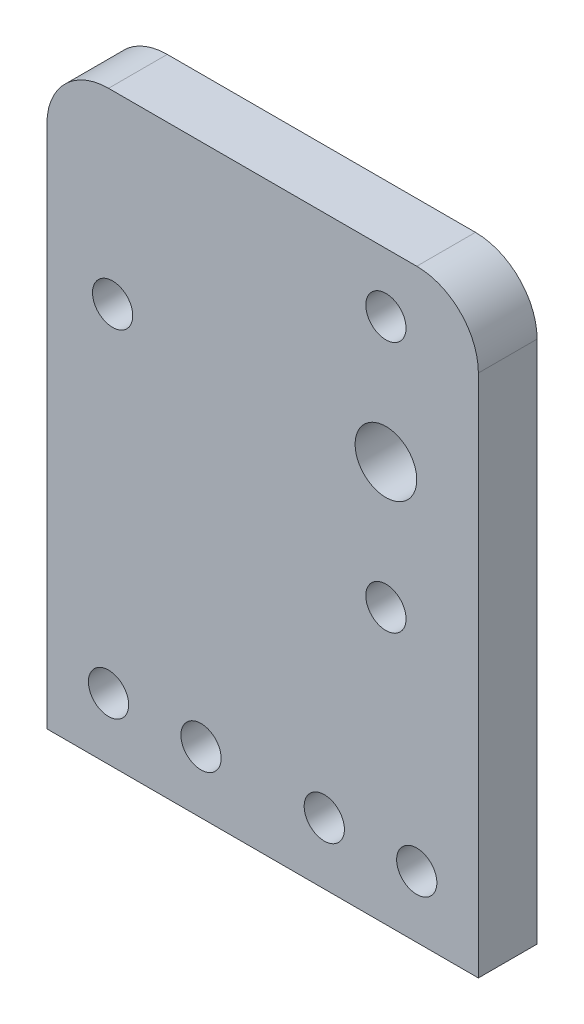
ISO-10303-21;
HEADER;
FILE_DESCRIPTION(('STEP AP214'),'2;1');
FILE_NAME('part.step','',(''),(''),'','','');
FILE_SCHEMA(('AUTOMOTIVE_DESIGN { 1 0 10303 214 1 1 1 1 }'));
ENDSEC;
DATA;
#1=APPLICATION_CONTEXT('core data for automotive mechanical design processes');
#2=APPLICATION_PROTOCOL_DEFINITION('international standard','automotive_design',2000,#1);
#3=PRODUCT_CONTEXT('',#1,'mechanical');
#4=PRODUCT('Part','Part','',(#3));
#5=PRODUCT_RELATED_PRODUCT_CATEGORY('part','',(#4));
#6=PRODUCT_DEFINITION_FORMATION('','',#4);
#7=PRODUCT_DEFINITION_CONTEXT('part definition',#1,'design');
#8=PRODUCT_DEFINITION('design','',#6,#7);
#9=PRODUCT_DEFINITION_SHAPE('','',#8);
#10=(LENGTH_UNIT() NAMED_UNIT(*) SI_UNIT(.MILLI.,.METRE.));
#11=(NAMED_UNIT(*) PLANE_ANGLE_UNIT() SI_UNIT($,.RADIAN.));
#12=(NAMED_UNIT(*) SI_UNIT($,.STERADIAN.) SOLID_ANGLE_UNIT());
#13=UNCERTAINTY_MEASURE_WITH_UNIT(LENGTH_MEASURE(1.E-05),#10,'distance_accuracy_value','');
#14=(GEOMETRIC_REPRESENTATION_CONTEXT(3) GLOBAL_UNCERTAINTY_ASSIGNED_CONTEXT((#13)) GLOBAL_UNIT_ASSIGNED_CONTEXT((#10,
#11,#12)) REPRESENTATION_CONTEXT('',''));
#15=CARTESIAN_POINT('',(0.,0.,0.));
#16=DIRECTION('',(0.,0.,1.));
#17=DIRECTION('',(1.,0.,0.));
#18=AXIS2_PLACEMENT_3D('',#15,#16,#17);
#19=CARTESIAN_POINT('',(0.,0.,4.7625));
#20=DIRECTION('',(0.,0.,1.));
#21=DIRECTION('',(1.,0.,0.));
#22=AXIS2_PLACEMENT_3D('',#19,#20,#21);
#23=PLANE('',#22);
#24=CARTESIAN_POINT('',(-12.5,-18.75,4.7625));
#25=DIRECTION('',(0.,0.,1.));
#26=DIRECTION('',(1.,0.,0.));
#27=AXIS2_PLACEMENT_3D('',#24,#25,#26);
#28=CIRCLE('',#27,1.63195);
#29=CARTESIAN_POINT('',(-10.86805,-18.75,4.7625));
#30=VERTEX_POINT('',#29);
#31=EDGE_CURVE('E191',#30,#30,#28,.T.);
#32=ORIENTED_EDGE('',*,*,#31,.F.);
#33=EDGE_LOOP('',(#32));
#34=FACE_BOUND('',#33,.T.);
#35=CARTESIAN_POINT('',(12.5,-18.75,4.7625));
#36=DIRECTION('',(0.,0.,1.));
#37=DIRECTION('',(1.,0.,0.));
#38=AXIS2_PLACEMENT_3D('',#35,#36,#37);
#39=CIRCLE('',#38,1.63195);
#40=CARTESIAN_POINT('',(14.13195,-18.75,4.7625));
#41=VERTEX_POINT('',#40);
#42=EDGE_CURVE('E185',#41,#41,#39,.T.);
#43=ORIENTED_EDGE('',*,*,#42,.F.);
#44=EDGE_LOOP('',(#43));
#45=FACE_BOUND('',#44,.T.);
#46=CARTESIAN_POINT('',(-5.,-18.75,4.7625));
#47=DIRECTION('',(0.,0.,1.));
#48=DIRECTION('',(1.,0.,0.));
#49=AXIS2_PLACEMENT_3D('',#46,#47,#48);
#50=CIRCLE('',#49,1.63195);
#51=CARTESIAN_POINT('',(-3.36805,-18.75,4.7625));
#52=VERTEX_POINT('',#51);
#53=EDGE_CURVE('E179',#52,#52,#50,.T.);
#54=ORIENTED_EDGE('',*,*,#53,.F.);
#55=EDGE_LOOP('',(#54));
#56=FACE_BOUND('',#55,.T.);
#57=CARTESIAN_POINT('',(5.00000000000001,-18.75,4.7625));
#58=DIRECTION('',(0.,0.,1.));
#59=DIRECTION('',(1.,0.,0.));
#60=AXIS2_PLACEMENT_3D('',#57,#58,#59);
#61=CIRCLE('',#60,1.63195);
#62=CARTESIAN_POINT('',(6.63195000000001,-18.75,4.7625));
#63=VERTEX_POINT('',#62);
#64=EDGE_CURVE('E173',#63,#63,#61,.T.);
#65=ORIENTED_EDGE('',*,*,#64,.F.);
#66=EDGE_LOOP('',(#65));
#67=FACE_BOUND('',#66,.T.);
#68=CARTESIAN_POINT('',(10.,18.96,4.7625));
#69=DIRECTION('',(0.,0.,1.));
#70=DIRECTION('',(1.,0.,0.));
#71=AXIS2_PLACEMENT_3D('',#68,#69,#70);
#72=CIRCLE('',#71,1.63194999999999);
#73=CARTESIAN_POINT('',(11.63195,18.96,4.7625));
#74=VERTEX_POINT('',#73);
#75=EDGE_CURVE('E167',#74,#74,#72,.T.);
#76=ORIENTED_EDGE('',*,*,#75,.F.);
#77=EDGE_LOOP('',(#76));
#78=FACE_BOUND('',#77,.T.);
#79=CARTESIAN_POINT('',(10.,-1.46,4.7625));
#80=DIRECTION('',(0.,0.,1.));
#81=DIRECTION('',(1.,0.,0.));
#82=AXIS2_PLACEMENT_3D('',#79,#80,#81);
#83=CIRCLE('',#82,1.63194999999999);
#84=CARTESIAN_POINT('',(11.63195,-1.46,4.7625));
#85=VERTEX_POINT('',#84);
#86=EDGE_CURVE('E161',#85,#85,#83,.T.);
#87=ORIENTED_EDGE('',*,*,#86,.F.);
#88=EDGE_LOOP('',(#87));
#89=FACE_BOUND('',#88,.T.);
#90=CARTESIAN_POINT('',(-12.17,8.75,4.7625));
#91=DIRECTION('',(0.,0.,1.));
#92=DIRECTION('',(1.,0.,0.));
#93=AXIS2_PLACEMENT_3D('',#90,#91,#92);
#94=CIRCLE('',#93,1.63194999999999);
#95=CARTESIAN_POINT('',(-10.53805,8.75,4.7625));
#96=VERTEX_POINT('',#95);
#97=EDGE_CURVE('E155',#96,#96,#94,.T.);
#98=ORIENTED_EDGE('',*,*,#97,.F.);
#99=EDGE_LOOP('',(#98));
#100=FACE_BOUND('',#99,.T.);
#101=DIRECTION('',(0.,1.,0.));
#102=VECTOR('',#101,1.);
#103=CARTESIAN_POINT('',(17.5,23.75,4.7625));
#104=LINE('',#103,#102);
#105=CARTESIAN_POINT('',(17.5,-23.75,4.7625));
#106=VERTEX_POINT('',#105);
#107=CARTESIAN_POINT('',(17.5,18.75,4.7625));
#108=VERTEX_POINT('',#107);
#109=EDGE_CURVE('E120',#106,#108,#104,.T.);
#110=ORIENTED_EDGE('',*,*,#109,.T.);
#111=CARTESIAN_POINT('',(12.5,18.75,4.7625));
#112=DIRECTION('',(0.,0.,1.));
#113=DIRECTION('',(1.,0.,0.));
#114=AXIS2_PLACEMENT_3D('',#111,#112,#113);
#115=CIRCLE('',#114,5.);
#116=CARTESIAN_POINT('',(12.5,23.75,4.7625));
#117=VERTEX_POINT('',#116);
#118=EDGE_CURVE('E41',#108,#117,#115,.T.);
#119=ORIENTED_EDGE('',*,*,#118,.T.);
#120=DIRECTION('',(-1.,0.,0.));
#121=VECTOR('',#120,1.);
#122=CARTESIAN_POINT('',(-17.5,23.75,4.7625));
#123=LINE('',#122,#121);
#124=CARTESIAN_POINT('',(-12.5,23.75,4.7625));
#125=VERTEX_POINT('',#124);
#126=EDGE_CURVE('E94',#117,#125,#123,.T.);
#127=ORIENTED_EDGE('',*,*,#126,.T.);
#128=CARTESIAN_POINT('',(-12.5,18.75,4.7625));
#129=DIRECTION('',(0.,0.,1.));
#130=DIRECTION('',(1.,0.,0.));
#131=AXIS2_PLACEMENT_3D('',#128,#129,#130);
#132=CIRCLE('',#131,5.);
#133=CARTESIAN_POINT('',(-17.5,18.75,4.7625));
#134=VERTEX_POINT('',#133);
#135=EDGE_CURVE('E48',#125,#134,#132,.T.);
#136=ORIENTED_EDGE('',*,*,#135,.T.);
#137=DIRECTION('',(0.,-1.,0.));
#138=VECTOR('',#137,1.);
#139=CARTESIAN_POINT('',(-17.5,23.75,4.7625));
#140=LINE('',#139,#138);
#141=CARTESIAN_POINT('',(-17.5,-23.75,4.7625));
#142=VERTEX_POINT('',#141);
#143=EDGE_CURVE('E86',#134,#142,#140,.T.);
#144=ORIENTED_EDGE('',*,*,#143,.T.);
#145=DIRECTION('',(1.,0.,0.));
#146=VECTOR('',#145,1.);
#147=CARTESIAN_POINT('',(-17.5,-23.75,4.7625));
#148=LINE('',#147,#146);
#149=EDGE_CURVE('E90',#142,#106,#148,.T.);
#150=ORIENTED_EDGE('',*,*,#149,.T.);
#151=EDGE_LOOP('',(#110,#119,#127,#136,#144,#150));
#152=FACE_BOUND('',#151,.T.);
#153=CARTESIAN_POINT('',(10.,8.75,4.7625));
#154=DIRECTION('',(0.,0.,1.));
#155=DIRECTION('',(1.,0.,0.));
#156=AXIS2_PLACEMENT_3D('',#153,#154,#155);
#157=CIRCLE('',#156,2.5);
#158=CARTESIAN_POINT('',(7.5,8.75,4.7625));
#159=VERTEX_POINT('',#158);
#160=EDGE_CURVE('E115',#159,#159,#157,.T.);
#161=ORIENTED_EDGE('',*,*,#160,.F.);
#162=EDGE_LOOP('',(#161));
#163=FACE_BOUND('',#162,.T.);
#164=ADVANCED_FACE('F33',(#34,#45,#56,#67,#78,#89,#100,#152,#163),#23,.T.);
#165=CARTESIAN_POINT('',(0.,0.,0.));
#166=DIRECTION('',(0.,0.,1.));
#167=DIRECTION('',(1.,0.,0.));
#168=AXIS2_PLACEMENT_3D('',#165,#166,#167);
#169=PLANE('',#168);
#170=CARTESIAN_POINT('',(-12.5,-18.75,0.));
#171=DIRECTION('',(0.,0.,1.));
#172=DIRECTION('',(1.,0.,0.));
#173=AXIS2_PLACEMENT_3D('',#170,#171,#172);
#174=CIRCLE('',#173,1.63195);
#175=CARTESIAN_POINT('',(-10.86805,-18.75,0.));
#176=VERTEX_POINT('',#175);
#177=EDGE_CURVE('E188',#176,#176,#174,.T.);
#178=ORIENTED_EDGE('',*,*,#177,.T.);
#179=EDGE_LOOP('',(#178));
#180=FACE_BOUND('',#179,.T.);
#181=CARTESIAN_POINT('',(12.5,-18.75,0.));
#182=DIRECTION('',(0.,0.,1.));
#183=DIRECTION('',(1.,0.,0.));
#184=AXIS2_PLACEMENT_3D('',#181,#182,#183);
#185=CIRCLE('',#184,1.63195);
#186=CARTESIAN_POINT('',(14.13195,-18.75,0.));
#187=VERTEX_POINT('',#186);
#188=EDGE_CURVE('E182',#187,#187,#185,.T.);
#189=ORIENTED_EDGE('',*,*,#188,.T.);
#190=EDGE_LOOP('',(#189));
#191=FACE_BOUND('',#190,.T.);
#192=CARTESIAN_POINT('',(-5.,-18.75,0.));
#193=DIRECTION('',(0.,0.,1.));
#194=DIRECTION('',(1.,0.,0.));
#195=AXIS2_PLACEMENT_3D('',#192,#193,#194);
#196=CIRCLE('',#195,1.63195);
#197=CARTESIAN_POINT('',(-3.36805,-18.75,0.));
#198=VERTEX_POINT('',#197);
#199=EDGE_CURVE('E176',#198,#198,#196,.T.);
#200=ORIENTED_EDGE('',*,*,#199,.T.);
#201=EDGE_LOOP('',(#200));
#202=FACE_BOUND('',#201,.T.);
#203=CARTESIAN_POINT('',(5.00000000000001,-18.75,0.));
#204=DIRECTION('',(0.,0.,1.));
#205=DIRECTION('',(1.,0.,0.));
#206=AXIS2_PLACEMENT_3D('',#203,#204,#205);
#207=CIRCLE('',#206,1.63195);
#208=CARTESIAN_POINT('',(6.63195000000001,-18.75,0.));
#209=VERTEX_POINT('',#208);
#210=EDGE_CURVE('E170',#209,#209,#207,.T.);
#211=ORIENTED_EDGE('',*,*,#210,.T.);
#212=EDGE_LOOP('',(#211));
#213=FACE_BOUND('',#212,.T.);
#214=CARTESIAN_POINT('',(10.,18.96,0.));
#215=DIRECTION('',(0.,0.,1.));
#216=DIRECTION('',(1.,0.,0.));
#217=AXIS2_PLACEMENT_3D('',#214,#215,#216);
#218=CIRCLE('',#217,1.63194999999999);
#219=CARTESIAN_POINT('',(11.63195,18.96,0.));
#220=VERTEX_POINT('',#219);
#221=EDGE_CURVE('E164',#220,#220,#218,.T.);
#222=ORIENTED_EDGE('',*,*,#221,.T.);
#223=EDGE_LOOP('',(#222));
#224=FACE_BOUND('',#223,.T.);
#225=CARTESIAN_POINT('',(10.,-1.46,0.));
#226=DIRECTION('',(0.,0.,1.));
#227=DIRECTION('',(1.,0.,0.));
#228=AXIS2_PLACEMENT_3D('',#225,#226,#227);
#229=CIRCLE('',#228,1.63194999999999);
#230=CARTESIAN_POINT('',(11.63195,-1.46,0.));
#231=VERTEX_POINT('',#230);
#232=EDGE_CURVE('E158',#231,#231,#229,.T.);
#233=ORIENTED_EDGE('',*,*,#232,.T.);
#234=EDGE_LOOP('',(#233));
#235=FACE_BOUND('',#234,.T.);
#236=CARTESIAN_POINT('',(-12.17,8.75,0.));
#237=DIRECTION('',(0.,0.,1.));
#238=DIRECTION('',(1.,0.,0.));
#239=AXIS2_PLACEMENT_3D('',#236,#237,#238);
#240=CIRCLE('',#239,1.63194999999999);
#241=CARTESIAN_POINT('',(-10.53805,8.75,0.));
#242=VERTEX_POINT('',#241);
#243=EDGE_CURVE('E150',#242,#242,#240,.T.);
#244=ORIENTED_EDGE('',*,*,#243,.T.);
#245=EDGE_LOOP('',(#244));
#246=FACE_BOUND('',#245,.T.);
#247=DIRECTION('',(-1.,0.,0.));
#248=VECTOR('',#247,1.);
#249=CARTESIAN_POINT('',(-17.5,23.75,0.));
#250=LINE('',#249,#248);
#251=CARTESIAN_POINT('',(12.5,23.75,0.));
#252=VERTEX_POINT('',#251);
#253=CARTESIAN_POINT('',(-12.5,23.75,0.));
#254=VERTEX_POINT('',#253);
#255=EDGE_CURVE('E114',#252,#254,#250,.T.);
#256=ORIENTED_EDGE('',*,*,#255,.F.);
#257=CARTESIAN_POINT('',(12.5,18.75,0.));
#258=DIRECTION('',(0.,0.,1.));
#259=DIRECTION('',(1.,0.,0.));
#260=AXIS2_PLACEMENT_3D('',#257,#258,#259);
#261=CIRCLE('',#260,5.);
#262=CARTESIAN_POINT('',(17.5,18.75,0.));
#263=VERTEX_POINT('',#262);
#264=EDGE_CURVE('E128',#252,#263,#261,.F.);
#265=ORIENTED_EDGE('',*,*,#264,.T.);
#266=DIRECTION('',(0.,1.,0.));
#267=VECTOR('',#266,1.);
#268=CARTESIAN_POINT('',(17.5,23.75,0.));
#269=LINE('',#268,#267);
#270=CARTESIAN_POINT('',(17.5,-23.75,0.));
#271=VERTEX_POINT('',#270);
#272=EDGE_CURVE('E112',#271,#263,#269,.T.);
#273=ORIENTED_EDGE('',*,*,#272,.F.);
#274=DIRECTION('',(1.,0.,0.));
#275=VECTOR('',#274,1.);
#276=CARTESIAN_POINT('',(-17.5,-23.75,0.));
#277=LINE('',#276,#275);
#278=CARTESIAN_POINT('',(-17.5,-23.75,0.));
#279=VERTEX_POINT('',#278);
#280=EDGE_CURVE('E119',#279,#271,#277,.T.);
#281=ORIENTED_EDGE('',*,*,#280,.F.);
#282=DIRECTION('',(0.,-1.,0.));
#283=VECTOR('',#282,1.);
#284=CARTESIAN_POINT('',(-17.5,23.75,0.));
#285=LINE('',#284,#283);
#286=CARTESIAN_POINT('',(-17.5,18.75,0.));
#287=VERTEX_POINT('',#286);
#288=EDGE_CURVE('E100',#287,#279,#285,.T.);
#289=ORIENTED_EDGE('',*,*,#288,.F.);
#290=CARTESIAN_POINT('',(-12.5,18.75,0.));
#291=DIRECTION('',(0.,0.,1.));
#292=DIRECTION('',(1.,0.,0.));
#293=AXIS2_PLACEMENT_3D('',#290,#291,#292);
#294=CIRCLE('',#293,5.);
#295=EDGE_CURVE('E126',#287,#254,#294,.F.);
#296=ORIENTED_EDGE('',*,*,#295,.T.);
#297=EDGE_LOOP('',(#256,#265,#273,#281,#289,#296));
#298=FACE_BOUND('',#297,.T.);
#299=CARTESIAN_POINT('',(10.,8.75,0.));
#300=DIRECTION('',(0.,0.,1.));
#301=DIRECTION('',(1.,0.,0.));
#302=AXIS2_PLACEMENT_3D('',#299,#300,#301);
#303=CIRCLE('',#302,2.5);
#304=CARTESIAN_POINT('',(7.5,8.75,0.));
#305=VERTEX_POINT('',#304);
#306=EDGE_CURVE('E147',#305,#305,#303,.T.);
#307=ORIENTED_EDGE('',*,*,#306,.T.);
#308=EDGE_LOOP('',(#307));
#309=FACE_BOUND('',#308,.T.);
#310=ADVANCED_FACE('F142',(#180,#191,#202,#213,#224,#235,#246,#298,#309),#169,.F.);
#311=CARTESIAN_POINT('',(17.5,23.75,4.7625));
#312=DIRECTION('',(-1.,0.,0.));
#313=DIRECTION('',(0.,-1.,0.));
#314=AXIS2_PLACEMENT_3D('',#311,#312,#313);
#315=PLANE('',#314);
#316=ORIENTED_EDGE('',*,*,#272,.T.);
#317=DIRECTION('',(0.,0.,-1.));
#318=VECTOR('',#317,1.);
#319=CARTESIAN_POINT('',(17.5,18.75,4.7625));
#320=LINE('',#319,#318);
#321=EDGE_CURVE('E56',#263,#108,#320,.F.);
#322=ORIENTED_EDGE('',*,*,#321,.T.);
#323=ORIENTED_EDGE('',*,*,#109,.F.);
#324=DIRECTION('',(0.,0.,-1.));
#325=VECTOR('',#324,1.);
#326=CARTESIAN_POINT('',(17.5,-23.75,4.7625));
#327=LINE('',#326,#325);
#328=EDGE_CURVE('E104',#106,#271,#327,.T.);
#329=ORIENTED_EDGE('',*,*,#328,.T.);
#330=EDGE_LOOP('',(#316,#322,#323,#329));
#331=FACE_BOUND('',#330,.T.);
#332=ADVANCED_FACE('F144',(#331),#315,.F.);
#333=CARTESIAN_POINT('',(-17.5,23.75,4.7625));
#334=DIRECTION('',(0.,-1.,0.));
#335=DIRECTION('',(0.,0.,-1.));
#336=AXIS2_PLACEMENT_3D('',#333,#334,#335);
#337=PLANE('',#336);
#338=ORIENTED_EDGE('',*,*,#126,.F.);
#339=DIRECTION('',(0.,0.,-1.));
#340=VECTOR('',#339,1.);
#341=CARTESIAN_POINT('',(12.5,23.75,4.7625));
#342=LINE('',#341,#340);
#343=EDGE_CURVE('E123',#117,#252,#342,.T.);
#344=ORIENTED_EDGE('',*,*,#343,.T.);
#345=ORIENTED_EDGE('',*,*,#255,.T.);
#346=DIRECTION('',(0.,0.,-1.));
#347=VECTOR('',#346,1.);
#348=CARTESIAN_POINT('',(-12.5,23.75,4.7625));
#349=LINE('',#348,#347);
#350=EDGE_CURVE('E103',#254,#125,#349,.F.);
#351=ORIENTED_EDGE('',*,*,#350,.T.);
#352=EDGE_LOOP('',(#338,#344,#345,#351));
#353=FACE_BOUND('',#352,.T.);
#354=ADVANCED_FACE('F136',(#353),#337,.F.);
#355=CARTESIAN_POINT('',(-17.5,23.75,4.7625));
#356=DIRECTION('',(1.,0.,0.));
#357=DIRECTION('',(0.,1.,0.));
#358=AXIS2_PLACEMENT_3D('',#355,#356,#357);
#359=PLANE('',#358);
#360=ORIENTED_EDGE('',*,*,#143,.F.);
#361=DIRECTION('',(0.,0.,-1.));
#362=VECTOR('',#361,1.);
#363=CARTESIAN_POINT('',(-17.5,18.75,4.7625));
#364=LINE('',#363,#362);
#365=EDGE_CURVE('E11',#134,#287,#364,.T.);
#366=ORIENTED_EDGE('',*,*,#365,.T.);
#367=ORIENTED_EDGE('',*,*,#288,.T.);
#368=DIRECTION('',(0.,0.,-1.));
#369=VECTOR('',#368,1.);
#370=CARTESIAN_POINT('',(-17.5,-23.75,4.7625));
#371=LINE('',#370,#369);
#372=EDGE_CURVE('E97',#142,#279,#371,.T.);
#373=ORIENTED_EDGE('',*,*,#372,.F.);
#374=EDGE_LOOP('',(#360,#366,#367,#373));
#375=FACE_BOUND('',#374,.T.);
#376=ADVANCED_FACE('F98',(#375),#359,.F.);
#377=CARTESIAN_POINT('',(-17.5,-23.75,4.7625));
#378=DIRECTION('',(0.,1.,0.));
#379=DIRECTION('',(0.,0.,1.));
#380=AXIS2_PLACEMENT_3D('',#377,#378,#379);
#381=PLANE('',#380);
#382=ORIENTED_EDGE('',*,*,#280,.T.);
#383=ORIENTED_EDGE('',*,*,#328,.F.);
#384=ORIENTED_EDGE('',*,*,#149,.F.);
#385=ORIENTED_EDGE('',*,*,#372,.T.);
#386=EDGE_LOOP('',(#382,#383,#384,#385));
#387=FACE_BOUND('',#386,.T.);
#388=ADVANCED_FACE('F106',(#387),#381,.F.);
#389=CARTESIAN_POINT('',(10.,8.75,4.7625));
#390=DIRECTION('',(0.,0.,-1.));
#391=DIRECTION('',(-1.,0.,0.));
#392=AXIS2_PLACEMENT_3D('',#389,#390,#391);
#393=CYLINDRICAL_SURFACE('',#392,2.5);
#394=CARTESIAN_POINT('',(7.5,8.75,4.7625));
#395=CARTESIAN_POINT('',(7.5,8.75,4.712890625));
#396=CARTESIAN_POINT('',(7.5,8.75,4.66328125));
#397=CARTESIAN_POINT('',(7.5,8.75,4.5640625));
#398=CARTESIAN_POINT('',(7.5,8.75,4.514453125));
#399=CARTESIAN_POINT('',(7.5,8.75,4.415234375));
#400=CARTESIAN_POINT('',(7.5,8.75,4.365625));
#401=CARTESIAN_POINT('',(7.5,8.75,4.26640625));
#402=CARTESIAN_POINT('',(7.5,8.75,4.216796875));
#403=CARTESIAN_POINT('',(7.5,8.75,4.117578125));
#404=CARTESIAN_POINT('',(7.5,8.75,4.06796875));
#405=CARTESIAN_POINT('',(7.5,8.75,3.96875));
#406=CARTESIAN_POINT('',(7.5,8.75,3.919140625));
#407=CARTESIAN_POINT('',(7.5,8.75,3.819921875));
#408=CARTESIAN_POINT('',(7.5,8.75,3.7703125));
#409=CARTESIAN_POINT('',(7.5,8.75,3.67109375));
#410=CARTESIAN_POINT('',(7.5,8.75,3.621484375));
#411=CARTESIAN_POINT('',(7.5,8.75,3.522265625));
#412=CARTESIAN_POINT('',(7.5,8.75,3.47265625));
#413=CARTESIAN_POINT('',(7.5,8.75,3.3734375));
#414=CARTESIAN_POINT('',(7.5,8.75,3.323828125));
#415=CARTESIAN_POINT('',(7.5,8.75,3.224609375));
#416=CARTESIAN_POINT('',(7.5,8.75,3.175));
#417=CARTESIAN_POINT('',(7.5,8.75,3.07578125));
#418=CARTESIAN_POINT('',(7.5,8.75,3.026171875));
#419=CARTESIAN_POINT('',(7.5,8.75,2.926953125));
#420=CARTESIAN_POINT('',(7.5,8.75,2.87734375));
#421=CARTESIAN_POINT('',(7.5,8.75,2.778125));
#422=CARTESIAN_POINT('',(7.5,8.75,2.728515625));
#423=CARTESIAN_POINT('',(7.5,8.75,2.629296875));
#424=CARTESIAN_POINT('',(7.5,8.75,2.5796875));
#425=CARTESIAN_POINT('',(7.5,8.75,2.48046875));
#426=CARTESIAN_POINT('',(7.5,8.75,2.430859375));
#427=CARTESIAN_POINT('',(7.5,8.75,2.331640625));
#428=CARTESIAN_POINT('',(7.5,8.75,2.28203125));
#429=CARTESIAN_POINT('',(7.5,8.75,2.1828125));
#430=CARTESIAN_POINT('',(7.5,8.75,2.133203125));
#431=CARTESIAN_POINT('',(7.5,8.75,2.033984375));
#432=CARTESIAN_POINT('',(7.5,8.75,1.984375));
#433=CARTESIAN_POINT('',(7.5,8.75,1.88515625));
#434=CARTESIAN_POINT('',(7.5,8.75,1.835546875));
#435=CARTESIAN_POINT('',(7.5,8.75,1.736328125));
#436=CARTESIAN_POINT('',(7.5,8.75,1.68671875));
#437=CARTESIAN_POINT('',(7.5,8.75,1.5875));
#438=CARTESIAN_POINT('',(7.5,8.75,1.537890625));
#439=CARTESIAN_POINT('',(7.5,8.75,1.438671875));
#440=CARTESIAN_POINT('',(7.5,8.75,1.3890625));
#441=CARTESIAN_POINT('',(7.5,8.75,1.28984375));
#442=CARTESIAN_POINT('',(7.5,8.75,1.240234375));
#443=CARTESIAN_POINT('',(7.5,8.75,1.141015625));
#444=CARTESIAN_POINT('',(7.5,8.75,1.09140625));
#445=CARTESIAN_POINT('',(7.5,8.75,0.992187499999999));
#446=CARTESIAN_POINT('',(7.5,8.75,0.942578124999999));
#447=CARTESIAN_POINT('',(7.5,8.75,0.843359375));
#448=CARTESIAN_POINT('',(7.5,8.75,0.79375));
#449=CARTESIAN_POINT('',(7.5,8.75,0.69453125));
#450=CARTESIAN_POINT('',(7.5,8.75,0.644921875));
#451=CARTESIAN_POINT('',(7.5,8.75,0.545703125));
#452=CARTESIAN_POINT('',(7.5,8.75,0.49609375));
#453=CARTESIAN_POINT('',(7.5,8.75,0.396875));
#454=CARTESIAN_POINT('',(7.5,8.75,0.347265625));
#455=CARTESIAN_POINT('',(7.5,8.75,0.248046875));
#456=CARTESIAN_POINT('',(7.5,8.75,0.1984375));
#457=CARTESIAN_POINT('',(7.5,8.75,0.09921875));
#458=CARTESIAN_POINT('',(7.5,8.75,0.049609375));
#459=CARTESIAN_POINT('',(7.5,8.75,0.));
#460=B_SPLINE_CURVE_WITH_KNOTS('',3,(#394,#395,#396,#397,#398,#399,#400,#401,#402,#403,#404,
#405,#406,#407,#408,#409,#410,#411,#412,#413,#414,#415,#416,#417,#418,#419,#420,#421,#422,#423,
#424,#425,#426,#427,#428,#429,#430,#431,#432,#433,#434,#435,#436,#437,#438,#439,#440,#441,#442,
#443,#444,#445,#446,#447,#448,#449,#450,#451,#452,#453,#454,#455,#456,#457,#458,#459),
.UNSPECIFIED.,.F.,.F.,(4,2,2,2,2,2,2,2,2,2,2,2,2,2,2,2,2,2,2,2,2,2,2,2,2,2,2,2,2,2,2,2,4),(0.,
0.148828125,0.29765625,0.446484375,0.5953125,0.744140625,0.892968750000001,1.041796875,1.190625,
1.339453125,1.48828125,1.637109375,1.7859375,1.934765625,2.08359375,2.232421875,2.38125,
2.530078125,2.67890625,2.827734375,2.9765625,3.125390625,3.27421875,3.423046875,3.571875,
3.720703125,3.86953125,4.018359375,4.1671875,4.316015625,4.46484375,4.613671875,4.7625),.UNSPECIFIED.);
#461=EDGE_CURVE('BSEAM215',#159,#305,#460,.T.);
#462=ORIENTED_EDGE('',*,*,#160,.T.);
#463=ORIENTED_EDGE('',*,*,#306,.F.);
#464=ORIENTED_EDGE('',*,*,#461,.T.);
#465=ORIENTED_EDGE('',*,*,#461,.F.);
#466=EDGE_LOOP('',(#462,#464,#463,#465));
#467=FACE_BOUND('',#466,.T.);
#468=ADVANCED_FACE('F215',(#467),#393,.F.);
#469=CARTESIAN_POINT('',(-12.17,8.75,4.7625));
#470=DIRECTION('',(0.,0.,1.));
#471=DIRECTION('',(1.,0.,0.));
#472=AXIS2_PLACEMENT_3D('',#469,#470,#471);
#473=CYLINDRICAL_SURFACE('',#472,1.63194999999999);
#474=ORIENTED_EDGE('',*,*,#243,.F.);
#475=EDGE_LOOP('',(#474));
#476=FACE_BOUND('',#475,.T.);
#477=ORIENTED_EDGE('',*,*,#97,.T.);
#478=EDGE_LOOP('',(#477));
#479=FACE_BOUND('',#478,.T.);
#480=ADVANCED_FACE('F212',(#476,#479),#473,.F.);
#481=CARTESIAN_POINT('',(10.,-1.46,4.7625));
#482=DIRECTION('',(0.,0.,1.));
#483=DIRECTION('',(1.,0.,0.));
#484=AXIS2_PLACEMENT_3D('',#481,#482,#483);
#485=CYLINDRICAL_SURFACE('',#484,1.63194999999999);
#486=ORIENTED_EDGE('',*,*,#232,.F.);
#487=EDGE_LOOP('',(#486));
#488=FACE_BOUND('',#487,.T.);
#489=ORIENTED_EDGE('',*,*,#86,.T.);
#490=EDGE_LOOP('',(#489));
#491=FACE_BOUND('',#490,.T.);
#492=ADVANCED_FACE('F214',(#488,#491),#485,.F.);
#493=CARTESIAN_POINT('',(10.,18.96,4.7625));
#494=DIRECTION('',(0.,0.,1.));
#495=DIRECTION('',(1.,0.,0.));
#496=AXIS2_PLACEMENT_3D('',#493,#494,#495);
#497=CYLINDRICAL_SURFACE('',#496,1.63194999999999);
#498=ORIENTED_EDGE('',*,*,#221,.F.);
#499=EDGE_LOOP('',(#498));
#500=FACE_BOUND('',#499,.T.);
#501=ORIENTED_EDGE('',*,*,#75,.T.);
#502=EDGE_LOOP('',(#501));
#503=FACE_BOUND('',#502,.T.);
#504=ADVANCED_FACE('F222',(#500,#503),#497,.F.);
#505=CARTESIAN_POINT('',(12.5,18.75,4.7625));
#506=DIRECTION('',(0.,0.,-1.));
#507=DIRECTION('',(-1.,0.,0.));
#508=AXIS2_PLACEMENT_3D('',#505,#506,#507);
#509=CYLINDRICAL_SURFACE('',#508,5.);
#510=ORIENTED_EDGE('',*,*,#118,.F.);
#511=ORIENTED_EDGE('',*,*,#321,.F.);
#512=ORIENTED_EDGE('',*,*,#264,.F.);
#513=ORIENTED_EDGE('',*,*,#343,.F.);
#514=EDGE_LOOP('',(#510,#511,#512,#513));
#515=FACE_BOUND('',#514,.T.);
#516=ADVANCED_FACE('F139',(#515),#509,.T.);
#517=CARTESIAN_POINT('',(-12.5,18.75,4.7625));
#518=DIRECTION('',(0.,0.,-1.));
#519=DIRECTION('',(-1.,0.,0.));
#520=AXIS2_PLACEMENT_3D('',#517,#518,#519);
#521=CYLINDRICAL_SURFACE('',#520,5.);
#522=ORIENTED_EDGE('',*,*,#135,.F.);
#523=ORIENTED_EDGE('',*,*,#350,.F.);
#524=ORIENTED_EDGE('',*,*,#295,.F.);
#525=ORIENTED_EDGE('',*,*,#365,.F.);
#526=EDGE_LOOP('',(#522,#523,#524,#525));
#527=FACE_BOUND('',#526,.T.);
#528=ADVANCED_FACE('F35',(#527),#521,.T.);
#529=CARTESIAN_POINT('',(5.00000000000001,-18.75,4.7625));
#530=DIRECTION('',(0.,0.,1.));
#531=DIRECTION('',(1.,0.,0.));
#532=AXIS2_PLACEMENT_3D('',#529,#530,#531);
#533=CYLINDRICAL_SURFACE('',#532,1.63195);
#534=ORIENTED_EDGE('',*,*,#210,.F.);
#535=EDGE_LOOP('',(#534));
#536=FACE_BOUND('',#535,.T.);
#537=ORIENTED_EDGE('',*,*,#64,.T.);
#538=EDGE_LOOP('',(#537));
#539=FACE_BOUND('',#538,.T.);
#540=ADVANCED_FACE('F245',(#536,#539),#533,.F.);
#541=CARTESIAN_POINT('',(-5.,-18.75,4.7625));
#542=DIRECTION('',(0.,0.,1.));
#543=DIRECTION('',(1.,0.,0.));
#544=AXIS2_PLACEMENT_3D('',#541,#542,#543);
#545=CYLINDRICAL_SURFACE('',#544,1.63195);
#546=ORIENTED_EDGE('',*,*,#199,.F.);
#547=EDGE_LOOP('',(#546));
#548=FACE_BOUND('',#547,.T.);
#549=ORIENTED_EDGE('',*,*,#53,.T.);
#550=EDGE_LOOP('',(#549));
#551=FACE_BOUND('',#550,.T.);
#552=ADVANCED_FACE('F255',(#548,#551),#545,.F.);
#553=CARTESIAN_POINT('',(12.5,-18.75,4.7625));
#554=DIRECTION('',(0.,0.,1.));
#555=DIRECTION('',(1.,0.,0.));
#556=AXIS2_PLACEMENT_3D('',#553,#554,#555);
#557=CYLINDRICAL_SURFACE('',#556,1.63195);
#558=ORIENTED_EDGE('',*,*,#188,.F.);
#559=EDGE_LOOP('',(#558));
#560=FACE_BOUND('',#559,.T.);
#561=ORIENTED_EDGE('',*,*,#42,.T.);
#562=EDGE_LOOP('',(#561));
#563=FACE_BOUND('',#562,.T.);
#564=ADVANCED_FACE('F259',(#560,#563),#557,.F.);
#565=CARTESIAN_POINT('',(-12.5,-18.75,4.7625));
#566=DIRECTION('',(0.,0.,1.));
#567=DIRECTION('',(1.,0.,0.));
#568=AXIS2_PLACEMENT_3D('',#565,#566,#567);
#569=CYLINDRICAL_SURFACE('',#568,1.63195);
#570=ORIENTED_EDGE('',*,*,#177,.F.);
#571=EDGE_LOOP('',(#570));
#572=FACE_BOUND('',#571,.T.);
#573=ORIENTED_EDGE('',*,*,#31,.T.);
#574=EDGE_LOOP('',(#573));
#575=FACE_BOUND('',#574,.T.);
#576=ADVANCED_FACE('F195',(#572,#575),#569,.F.);
#577=CLOSED_SHELL('',(#164,#310,#332,#354,#376,#388,#468,#480,#492,#504,#516,#528,#540,#552,
#564,#576));
#578=MANIFOLD_SOLID_BREP('B2',#577);
#579=ADVANCED_BREP_SHAPE_REPRESENTATION('',(#18,#578),#14);
#580=SHAPE_DEFINITION_REPRESENTATION(#9,#579);
ENDSEC;
END-ISO-10303-21;
